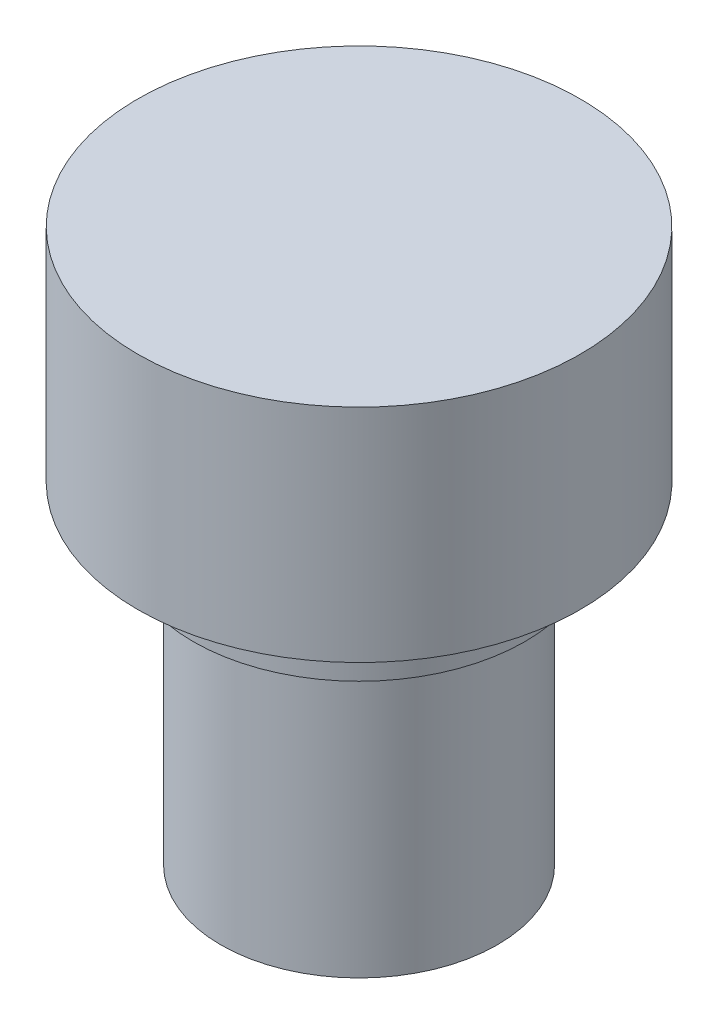
ISO-10303-21;
HEADER;
FILE_DESCRIPTION(('STEP AP214'),'2;1');
FILE_NAME('part.step','',(''),(''),'','','');
FILE_SCHEMA(('AUTOMOTIVE_DESIGN { 1 0 10303 214 1 1 1 1 }'));
ENDSEC;
DATA;
#1=APPLICATION_CONTEXT('core data for automotive mechanical design processes');
#2=APPLICATION_PROTOCOL_DEFINITION('international standard','automotive_design',2000,#1);
#3=PRODUCT_CONTEXT('',#1,'mechanical');
#4=PRODUCT('Part','Part','',(#3));
#5=PRODUCT_RELATED_PRODUCT_CATEGORY('part','',(#4));
#6=PRODUCT_DEFINITION_FORMATION('','',#4);
#7=PRODUCT_DEFINITION_CONTEXT('part definition',#1,'design');
#8=PRODUCT_DEFINITION('design','',#6,#7);
#9=PRODUCT_DEFINITION_SHAPE('','',#8);
#10=(LENGTH_UNIT() NAMED_UNIT(*) SI_UNIT(.MILLI.,.METRE.));
#11=(NAMED_UNIT(*) PLANE_ANGLE_UNIT() SI_UNIT($,.RADIAN.));
#12=(NAMED_UNIT(*) SI_UNIT($,.STERADIAN.) SOLID_ANGLE_UNIT());
#13=UNCERTAINTY_MEASURE_WITH_UNIT(LENGTH_MEASURE(1.E-05),#10,'distance_accuracy_value','');
#14=(GEOMETRIC_REPRESENTATION_CONTEXT(3) GLOBAL_UNCERTAINTY_ASSIGNED_CONTEXT((#13)) GLOBAL_UNIT_ASSIGNED_CONTEXT((#10,
#11,#12)) REPRESENTATION_CONTEXT('',''));
#15=CARTESIAN_POINT('',(0.,0.,0.));
#16=DIRECTION('',(0.,0.,1.));
#17=DIRECTION('',(1.,0.,0.));
#18=AXIS2_PLACEMENT_3D('',#15,#16,#17);
#19=CARTESIAN_POINT('',(0.,4.,0.));
#20=DIRECTION('',(0.,-1.,0.));
#21=DIRECTION('',(0.,0.,-1.));
#22=AXIS2_PLACEMENT_3D('',#19,#20,#21);
#23=CYLINDRICAL_SURFACE('',#22,4.);
#24=CARTESIAN_POINT('',(0.,4.,0.));
#25=DIRECTION('',(0.,1.,0.));
#26=DIRECTION('',(0.,0.,1.));
#27=AXIS2_PLACEMENT_3D('',#24,#25,#26);
#28=CIRCLE('',#27,4.);
#29=CARTESIAN_POINT('',(0.,4.,4.));
#30=VERTEX_POINT('',#29);
#31=EDGE_CURVE('E45',#30,#30,#28,.T.);
#32=ORIENTED_EDGE('',*,*,#31,.F.);
#33=EDGE_LOOP('',(#32));
#34=FACE_BOUND('',#33,.T.);
#35=CARTESIAN_POINT('',(0.,0.,0.));
#36=DIRECTION('',(0.,1.,0.));
#37=DIRECTION('',(0.,0.,1.));
#38=AXIS2_PLACEMENT_3D('',#35,#36,#37);
#39=CIRCLE('',#38,4.);
#40=CARTESIAN_POINT('',(0.,0.,4.));
#41=VERTEX_POINT('',#40);
#42=EDGE_CURVE('E74',#41,#41,#39,.T.);
#43=ORIENTED_EDGE('',*,*,#42,.T.);
#44=EDGE_LOOP('',(#43));
#45=FACE_BOUND('',#44,.T.);
#46=ADVANCED_FACE('F38',(#34,#45),#23,.T.);
#47=CARTESIAN_POINT('',(0.,4.,0.));
#48=DIRECTION('',(0.,1.,0.));
#49=DIRECTION('',(0.,0.,1.));
#50=AXIS2_PLACEMENT_3D('',#47,#48,#49);
#51=PLANE('',#50);
#52=ORIENTED_EDGE('',*,*,#31,.T.);
#53=EDGE_LOOP('',(#52));
#54=FACE_BOUND('',#53,.T.);
#55=ADVANCED_FACE('F102',(#54),#51,.T.);
#56=CARTESIAN_POINT('',(0.,0.,0.));
#57=DIRECTION('',(0.,1.,0.));
#58=DIRECTION('',(0.,0.,1.));
#59=AXIS2_PLACEMENT_3D('',#56,#57,#58);
#60=PLANE('',#59);
#61=CARTESIAN_POINT('',(0.,0.,0.));
#62=DIRECTION('',(0.,1.,0.));
#63=DIRECTION('',(0.,0.,1.));
#64=AXIS2_PLACEMENT_3D('',#61,#62,#63);
#65=CIRCLE('',#64,3.);
#66=CARTESIAN_POINT('',(0.,0.,3.));
#67=VERTEX_POINT('',#66);
#68=EDGE_CURVE('E11',#67,#67,#65,.F.);
#69=ORIENTED_EDGE('',*,*,#68,.F.);
#70=EDGE_LOOP('',(#69));
#71=FACE_BOUND('',#70,.T.);
#72=ORIENTED_EDGE('',*,*,#42,.F.);
#73=EDGE_LOOP('',(#72));
#74=FACE_BOUND('',#73,.T.);
#75=ADVANCED_FACE('F96',(#71,#74),#60,.F.);
#76=CARTESIAN_POINT('',(0.,-1.,0.));
#77=DIRECTION('',(0.,1.,0.));
#78=DIRECTION('',(0.,0.,1.));
#79=AXIS2_PLACEMENT_3D('',#76,#77,#78);
#80=CYLINDRICAL_SURFACE('',#79,3.);
#81=CARTESIAN_POINT('',(0.,-1.,0.));
#82=DIRECTION('',(0.,-1.,0.));
#83=DIRECTION('',(0.,0.,-1.));
#84=AXIS2_PLACEMENT_3D('',#81,#82,#83);
#85=CIRCLE('',#84,3.);
#86=CARTESIAN_POINT('',(0.,-1.,-3.));
#87=VERTEX_POINT('',#86);
#88=EDGE_CURVE('E59',#87,#87,#85,.T.);
#89=ORIENTED_EDGE('',*,*,#88,.F.);
#90=EDGE_LOOP('',(#89));
#91=FACE_BOUND('',#90,.T.);
#92=ORIENTED_EDGE('',*,*,#68,.T.);
#93=EDGE_LOOP('',(#92));
#94=FACE_BOUND('',#93,.T.);
#95=ADVANCED_FACE('F90',(#91,#94),#80,.T.);
#96=CARTESIAN_POINT('',(0.,-1.,0.));
#97=DIRECTION('',(0.,-1.,0.));
#98=DIRECTION('',(0.,0.,-1.));
#99=AXIS2_PLACEMENT_3D('',#96,#97,#98);
#100=PLANE('',#99);
#101=CARTESIAN_POINT('',(0.,-1.,0.));
#102=DIRECTION('',(0.,-1.,0.));
#103=DIRECTION('',(0.,0.,-1.));
#104=AXIS2_PLACEMENT_3D('',#101,#102,#103);
#105=CIRCLE('',#104,2.5);
#106=CARTESIAN_POINT('',(0.,-1.,-2.5));
#107=VERTEX_POINT('',#106);
#108=EDGE_CURVE('E65',#107,#107,#105,.T.);
#109=ORIENTED_EDGE('',*,*,#108,.F.);
#110=EDGE_LOOP('',(#109));
#111=FACE_BOUND('',#110,.T.);
#112=ORIENTED_EDGE('',*,*,#88,.T.);
#113=EDGE_LOOP('',(#112));
#114=FACE_BOUND('',#113,.T.);
#115=ADVANCED_FACE('F86',(#111,#114),#100,.T.);
#116=CARTESIAN_POINT('',(0.,-6.,0.));
#117=DIRECTION('',(0.,-1.,0.));
#118=DIRECTION('',(0.,0.,-1.));
#119=AXIS2_PLACEMENT_3D('',#116,#117,#118);
#120=PLANE('',#119);
#121=CARTESIAN_POINT('',(0.,-6.,0.));
#122=DIRECTION('',(0.,-1.,0.));
#123=DIRECTION('',(0.,0.,-1.));
#124=AXIS2_PLACEMENT_3D('',#121,#122,#123);
#125=CIRCLE('',#124,1.25);
#126=CARTESIAN_POINT('',(0.,-6.,-1.25));
#127=VERTEX_POINT('',#126);
#128=EDGE_CURVE('E60',#127,#127,#125,.T.);
#129=ORIENTED_EDGE('',*,*,#128,.F.);
#130=EDGE_LOOP('',(#129));
#131=FACE_BOUND('',#130,.T.);
#132=CARTESIAN_POINT('',(0.,-6.,0.));
#133=DIRECTION('',(0.,-1.,0.));
#134=DIRECTION('',(0.,0.,-1.));
#135=AXIS2_PLACEMENT_3D('',#132,#133,#134);
#136=CIRCLE('',#135,2.5);
#137=CARTESIAN_POINT('',(0.,-6.,-2.5));
#138=VERTEX_POINT('',#137);
#139=EDGE_CURVE('E70',#138,#138,#136,.T.);
#140=ORIENTED_EDGE('',*,*,#139,.T.);
#141=EDGE_LOOP('',(#140));
#142=FACE_BOUND('',#141,.T.);
#143=ADVANCED_FACE('F89',(#131,#142),#120,.T.);
#144=CARTESIAN_POINT('',(0.,-6.,0.));
#145=DIRECTION('',(0.,1.,0.));
#146=DIRECTION('',(0.,0.,1.));
#147=AXIS2_PLACEMENT_3D('',#144,#145,#146);
#148=CYLINDRICAL_SURFACE('',#147,2.5);
#149=ORIENTED_EDGE('',*,*,#108,.T.);
#150=EDGE_LOOP('',(#149));
#151=FACE_BOUND('',#150,.T.);
#152=ORIENTED_EDGE('',*,*,#139,.F.);
#153=EDGE_LOOP('',(#152));
#154=FACE_BOUND('',#153,.T.);
#155=ADVANCED_FACE('F52',(#151,#154),#148,.T.);
#156=CARTESIAN_POINT('',(0.,2.,0.));
#157=DIRECTION('',(0.,-1.,0.));
#158=DIRECTION('',(0.,0.,-1.));
#159=AXIS2_PLACEMENT_3D('',#156,#157,#158);
#160=CONICAL_SURFACE('',#159,1.25,1.02974425867665);
#161=CARTESIAN_POINT('',(0.,2.75107577378445,0.));
#162=VERTEX_POINT('',#161);
#163=VERTEX_LOOP('',#162);
#164=FACE_BOUND('',#163,.T.);
#165=CARTESIAN_POINT('',(0.,2.,0.));
#166=DIRECTION('',(0.,-1.,0.));
#167=DIRECTION('',(0.,0.,-1.));
#168=AXIS2_PLACEMENT_3D('',#165,#166,#167);
#169=CIRCLE('',#168,1.25);
#170=CARTESIAN_POINT('',(0.,2.,-1.25));
#171=VERTEX_POINT('',#170);
#172=EDGE_CURVE('E56',#171,#171,#169,.T.);
#173=ORIENTED_EDGE('',*,*,#172,.T.);
#174=EDGE_LOOP('',(#173));
#175=FACE_BOUND('',#174,.T.);
#176=ADVANCED_FACE('F48',(#164,#175),#160,.F.);
#177=CARTESIAN_POINT('',(0.,-6.,0.));
#178=DIRECTION('',(0.,-1.,0.));
#179=DIRECTION('',(0.,0.,-1.));
#180=AXIS2_PLACEMENT_3D('',#177,#178,#179);
#181=CYLINDRICAL_SURFACE('',#180,1.25);
#182=ORIENTED_EDGE('',*,*,#172,.F.);
#183=EDGE_LOOP('',(#182));
#184=FACE_BOUND('',#183,.T.);
#185=ORIENTED_EDGE('',*,*,#128,.T.);
#186=EDGE_LOOP('',(#185));
#187=FACE_BOUND('',#186,.T.);
#188=ADVANCED_FACE('F51',(#184,#187),#181,.F.);
#189=CLOSED_SHELL('',(#46,#55,#75,#95,#115,#143,#155,#176,#188));
#190=MANIFOLD_SOLID_BREP('B2',#189);
#191=ADVANCED_BREP_SHAPE_REPRESENTATION('',(#18,#190),#14);
#192=SHAPE_DEFINITION_REPRESENTATION(#9,#191);
ENDSEC;
END-ISO-10303-21;
